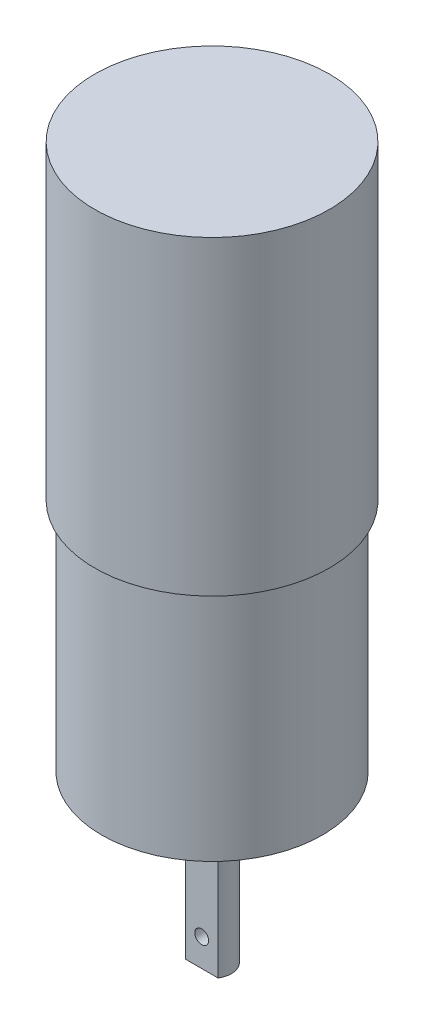
ISO-10303-21;
HEADER;
FILE_DESCRIPTION(('STEP AP214'),'2;1');
FILE_NAME('part.step','',(''),(''),'','','');
FILE_SCHEMA(('AUTOMOTIVE_DESIGN { 1 0 10303 214 1 1 1 1 }'));
ENDSEC;
DATA;
#1=APPLICATION_CONTEXT('core data for automotive mechanical design processes');
#2=APPLICATION_PROTOCOL_DEFINITION('international standard','automotive_design',2000,#1);
#3=PRODUCT_CONTEXT('',#1,'mechanical');
#4=PRODUCT('Part','Part','',(#3));
#5=PRODUCT_RELATED_PRODUCT_CATEGORY('part','',(#4));
#6=PRODUCT_DEFINITION_FORMATION('','',#4);
#7=PRODUCT_DEFINITION_CONTEXT('part definition',#1,'design');
#8=PRODUCT_DEFINITION('design','',#6,#7);
#9=PRODUCT_DEFINITION_SHAPE('','',#8);
#10=(LENGTH_UNIT() NAMED_UNIT(*) SI_UNIT(.MILLI.,.METRE.));
#11=(NAMED_UNIT(*) PLANE_ANGLE_UNIT() SI_UNIT($,.RADIAN.));
#12=(NAMED_UNIT(*) SI_UNIT($,.STERADIAN.) SOLID_ANGLE_UNIT());
#13=UNCERTAINTY_MEASURE_WITH_UNIT(LENGTH_MEASURE(1.E-05),#10,'distance_accuracy_value','');
#14=(GEOMETRIC_REPRESENTATION_CONTEXT(3) GLOBAL_UNCERTAINTY_ASSIGNED_CONTEXT((#13)) GLOBAL_UNIT_ASSIGNED_CONTEXT((#10,
#11,#12)) REPRESENTATION_CONTEXT('',''));
#15=CARTESIAN_POINT('',(0.,0.,0.));
#16=DIRECTION('',(0.,0.,1.));
#17=DIRECTION('',(1.,0.,0.));
#18=AXIS2_PLACEMENT_3D('',#15,#16,#17);
#19=CARTESIAN_POINT('',(0.,17.,0.));
#20=DIRECTION('',(0.,-1.,0.));
#21=DIRECTION('',(0.,0.,-1.));
#22=AXIS2_PLACEMENT_3D('',#19,#20,#21);
#23=CYLINDRICAL_SURFACE('',#22,8.);
#24=CARTESIAN_POINT('',(0.,17.,0.));
#25=DIRECTION('',(0.,1.,0.));
#26=DIRECTION('',(0.,0.,1.));
#27=AXIS2_PLACEMENT_3D('',#24,#25,#26);
#28=CIRCLE('',#27,8.);
#29=CARTESIAN_POINT('',(0.,17.,8.));
#30=VERTEX_POINT('',#29);
#31=EDGE_CURVE('E89',#30,#30,#28,.T.);
#32=ORIENTED_EDGE('',*,*,#31,.F.);
#33=EDGE_LOOP('',(#32));
#34=FACE_BOUND('',#33,.T.);
#35=CARTESIAN_POINT('',(0.,0.,0.));
#36=DIRECTION('',(0.,1.,0.));
#37=DIRECTION('',(0.,0.,1.));
#38=AXIS2_PLACEMENT_3D('',#35,#36,#37);
#39=CIRCLE('',#38,8.);
#40=CARTESIAN_POINT('',(0.,0.,8.));
#41=VERTEX_POINT('',#40);
#42=EDGE_CURVE('E39',#41,#41,#39,.T.);
#43=ORIENTED_EDGE('',*,*,#42,.T.);
#44=EDGE_LOOP('',(#43));
#45=FACE_BOUND('',#44,.T.);
#46=ADVANCED_FACE('F36',(#34,#45),#23,.T.);
#47=CARTESIAN_POINT('',(0.,0.,0.));
#48=DIRECTION('',(0.,1.,0.));
#49=DIRECTION('',(0.,0.,1.));
#50=AXIS2_PLACEMENT_3D('',#47,#48,#49);
#51=PLANE('',#50);
#52=CARTESIAN_POINT('',(0.,0.,0.));
#53=DIRECTION('',(0.,-1.,0.));
#54=DIRECTION('',(0.,0.,-1.));
#55=AXIS2_PLACEMENT_3D('',#52,#53,#54);
#56=CIRCLE('',#55,3.);
#57=CARTESIAN_POINT('',(0.,0.,-3.));
#58=VERTEX_POINT('',#57);
#59=EDGE_CURVE('E44',#58,#58,#56,.T.);
#60=ORIENTED_EDGE('',*,*,#59,.F.);
#61=EDGE_LOOP('',(#60));
#62=FACE_BOUND('',#61,.T.);
#63=ORIENTED_EDGE('',*,*,#42,.F.);
#64=EDGE_LOOP('',(#63));
#65=FACE_BOUND('',#64,.T.);
#66=ADVANCED_FACE('F101',(#62,#65),#51,.F.);
#67=CARTESIAN_POINT('',(0.,39.5,0.));
#68=DIRECTION('',(0.,-1.,0.));
#69=DIRECTION('',(0.,0.,-1.));
#70=AXIS2_PLACEMENT_3D('',#67,#68,#69);
#71=CYLINDRICAL_SURFACE('',#70,8.5);
#72=CARTESIAN_POINT('',(0.,39.5,0.));
#73=DIRECTION('',(0.,1.,0.));
#74=DIRECTION('',(0.,0.,1.));
#75=AXIS2_PLACEMENT_3D('',#72,#73,#74);
#76=CIRCLE('',#75,8.5);
#77=CARTESIAN_POINT('',(0.,39.5,-8.5));
#78=VERTEX_POINT('',#77);
#79=EDGE_CURVE('E90',#78,#78,#76,.T.);
#80=CARTESIAN_POINT('',(0.,17.,0.));
#81=DIRECTION('',(0.,1.,0.));
#82=DIRECTION('',(0.,0.,1.));
#83=AXIS2_PLACEMENT_3D('',#80,#81,#82);
#84=CIRCLE('',#83,8.5);
#85=CARTESIAN_POINT('',(0.,17.,-8.5));
#86=VERTEX_POINT('',#85);
#87=EDGE_CURVE('E82',#86,#86,#84,.T.);
#88=CARTESIAN_POINT('',(0.,39.5,-8.5));
#89=CARTESIAN_POINT('',(0.,39.265625,-8.5));
#90=CARTESIAN_POINT('',(0.,39.03125,-8.5));
#91=CARTESIAN_POINT('',(0.,38.5625,-8.5));
#92=CARTESIAN_POINT('',(0.,38.328125,-8.5));
#93=CARTESIAN_POINT('',(0.,37.859375,-8.5));
#94=CARTESIAN_POINT('',(0.,37.625,-8.5));
#95=CARTESIAN_POINT('',(0.,37.15625,-8.5));
#96=CARTESIAN_POINT('',(0.,36.921875,-8.5));
#97=CARTESIAN_POINT('',(0.,36.453125,-8.5));
#98=CARTESIAN_POINT('',(0.,36.21875,-8.5));
#99=CARTESIAN_POINT('',(0.,35.75,-8.5));
#100=CARTESIAN_POINT('',(0.,35.515625,-8.5));
#101=CARTESIAN_POINT('',(0.,35.046875,-8.5));
#102=CARTESIAN_POINT('',(0.,34.8125,-8.5));
#103=CARTESIAN_POINT('',(0.,34.34375,-8.5));
#104=CARTESIAN_POINT('',(0.,34.109375,-8.5));
#105=CARTESIAN_POINT('',(0.,33.640625,-8.5));
#106=CARTESIAN_POINT('',(0.,33.40625,-8.5));
#107=CARTESIAN_POINT('',(0.,32.9375,-8.5));
#108=CARTESIAN_POINT('',(0.,32.703125,-8.5));
#109=CARTESIAN_POINT('',(0.,32.234375,-8.5));
#110=CARTESIAN_POINT('',(0.,32.,-8.5));
#111=CARTESIAN_POINT('',(0.,31.53125,-8.5));
#112=CARTESIAN_POINT('',(0.,31.296875,-8.5));
#113=CARTESIAN_POINT('',(0.,30.828125,-8.5));
#114=CARTESIAN_POINT('',(0.,30.59375,-8.5));
#115=CARTESIAN_POINT('',(0.,30.125,-8.5));
#116=CARTESIAN_POINT('',(0.,29.890625,-8.5));
#117=CARTESIAN_POINT('',(0.,29.421875,-8.5));
#118=CARTESIAN_POINT('',(0.,29.1875,-8.5));
#119=CARTESIAN_POINT('',(0.,28.71875,-8.5));
#120=CARTESIAN_POINT('',(0.,28.484375,-8.5));
#121=CARTESIAN_POINT('',(0.,28.015625,-8.5));
#122=CARTESIAN_POINT('',(0.,27.78125,-8.5));
#123=CARTESIAN_POINT('',(0.,27.3125,-8.5));
#124=CARTESIAN_POINT('',(0.,27.078125,-8.5));
#125=CARTESIAN_POINT('',(0.,26.609375,-8.5));
#126=CARTESIAN_POINT('',(0.,26.375,-8.5));
#127=CARTESIAN_POINT('',(0.,25.90625,-8.5));
#128=CARTESIAN_POINT('',(0.,25.671875,-8.5));
#129=CARTESIAN_POINT('',(0.,25.203125,-8.5));
#130=CARTESIAN_POINT('',(0.,24.96875,-8.5));
#131=CARTESIAN_POINT('',(0.,24.5,-8.5));
#132=CARTESIAN_POINT('',(0.,24.265625,-8.5));
#133=CARTESIAN_POINT('',(0.,23.796875,-8.5));
#134=CARTESIAN_POINT('',(0.,23.5625,-8.5));
#135=CARTESIAN_POINT('',(0.,23.09375,-8.5));
#136=CARTESIAN_POINT('',(0.,22.859375,-8.5));
#137=CARTESIAN_POINT('',(0.,22.390625,-8.5));
#138=CARTESIAN_POINT('',(0.,22.15625,-8.5));
#139=CARTESIAN_POINT('',(0.,21.6875,-8.5));
#140=CARTESIAN_POINT('',(0.,21.453125,-8.5));
#141=CARTESIAN_POINT('',(0.,20.984375,-8.5));
#142=CARTESIAN_POINT('',(0.,20.75,-8.5));
#143=CARTESIAN_POINT('',(0.,20.28125,-8.5));
#144=CARTESIAN_POINT('',(0.,20.046875,-8.5));
#145=CARTESIAN_POINT('',(0.,19.578125,-8.5));
#146=CARTESIAN_POINT('',(0.,19.34375,-8.5));
#147=CARTESIAN_POINT('',(0.,18.875,-8.5));
#148=CARTESIAN_POINT('',(0.,18.640625,-8.5));
#149=CARTESIAN_POINT('',(0.,18.171875,-8.5));
#150=CARTESIAN_POINT('',(0.,17.9375,-8.5));
#151=CARTESIAN_POINT('',(0.,17.46875,-8.5));
#152=CARTESIAN_POINT('',(0.,17.234375,-8.5));
#153=CARTESIAN_POINT('',(0.,17.,-8.5));
#154=B_SPLINE_CURVE_WITH_KNOTS('',3,(#88,#89,#90,#91,#92,#93,#94,#95,#96,#97,#98,#99,#100,#101,
#102,#103,#104,#105,#106,#107,#108,#109,#110,#111,#112,#113,#114,#115,#116,#117,#118,#119,#120,
#121,#122,#123,#124,#125,#126,#127,#128,#129,#130,#131,#132,#133,#134,#135,#136,#137,#138,#139,
#140,#141,#142,#143,#144,#145,#146,#147,#148,#149,#150,#151,#152,#153),.UNSPECIFIED.,.F.,.F.,(4,
2,2,2,2,2,2,2,2,2,2,2,2,2,2,2,2,2,2,2,2,2,2,2,2,2,2,2,2,2,2,2,4),(0.,0.703125000000006,1.40625,
2.109375,2.8125,3.515625,4.21875,4.92187500000001,5.62500000000001,6.328125,7.03125,7.734375,
8.4375,9.140625,9.84375000000001,10.546875,11.25,11.953125,12.65625,13.359375,14.0625,14.765625,
15.46875,16.171875,16.875,17.578125,18.28125,18.984375,19.6875,20.390625,21.09375,21.796875,
22.5),.UNSPECIFIED.);
#155=EDGE_CURVE('BSEAM103',#78,#86,#154,.T.);
#156=ORIENTED_EDGE('',*,*,#79,.F.);
#157=ORIENTED_EDGE('',*,*,#87,.T.);
#158=ORIENTED_EDGE('',*,*,#155,.T.);
#159=ORIENTED_EDGE('',*,*,#155,.F.);
#160=EDGE_LOOP('',(#156,#158,#157,#159));
#161=FACE_BOUND('',#160,.T.);
#162=ADVANCED_FACE('F103',(#161),#71,.T.);
#163=CARTESIAN_POINT('',(0.,39.5,0.));
#164=DIRECTION('',(0.,1.,0.));
#165=DIRECTION('',(0.,0.,1.));
#166=AXIS2_PLACEMENT_3D('',#163,#164,#165);
#167=PLANE('',#166);
#168=ORIENTED_EDGE('',*,*,#79,.T.);
#169=EDGE_LOOP('',(#168));
#170=FACE_BOUND('',#169,.T.);
#171=ADVANCED_FACE('F109',(#170),#167,.T.);
#172=CARTESIAN_POINT('',(0.,17.,0.));
#173=DIRECTION('',(0.,1.,0.));
#174=DIRECTION('',(0.,0.,1.));
#175=AXIS2_PLACEMENT_3D('',#172,#173,#174);
#176=PLANE('',#175);
#177=ORIENTED_EDGE('',*,*,#31,.T.);
#178=EDGE_LOOP('',(#177));
#179=FACE_BOUND('',#178,.T.);
#180=ORIENTED_EDGE('',*,*,#87,.F.);
#181=EDGE_LOOP('',(#180));
#182=FACE_BOUND('',#181,.T.);
#183=ADVANCED_FACE('F115',(#179,#182),#176,.F.);
#184=CARTESIAN_POINT('',(0.,-2.,0.));
#185=DIRECTION('',(0.,1.,0.));
#186=DIRECTION('',(0.,0.,1.));
#187=AXIS2_PLACEMENT_3D('',#184,#185,#186);
#188=CYLINDRICAL_SURFACE('',#187,3.);
#189=CARTESIAN_POINT('',(0.,-2.,0.));
#190=DIRECTION('',(0.,-1.,0.));
#191=DIRECTION('',(0.,0.,-1.));
#192=AXIS2_PLACEMENT_3D('',#189,#190,#191);
#193=CIRCLE('',#192,3.);
#194=CARTESIAN_POINT('',(0.,-2.,-3.));
#195=VERTEX_POINT('',#194);
#196=EDGE_CURVE('E79',#195,#195,#193,.T.);
#197=ORIENTED_EDGE('',*,*,#196,.F.);
#198=EDGE_LOOP('',(#197));
#199=FACE_BOUND('',#198,.T.);
#200=ORIENTED_EDGE('',*,*,#59,.T.);
#201=EDGE_LOOP('',(#200));
#202=FACE_BOUND('',#201,.T.);
#203=ADVANCED_FACE('F118',(#199,#202),#188,.T.);
#204=CARTESIAN_POINT('',(0.,-2.,0.));
#205=DIRECTION('',(0.,-1.,0.));
#206=DIRECTION('',(0.,0.,-1.));
#207=AXIS2_PLACEMENT_3D('',#204,#205,#206);
#208=PLANE('',#207);
#209=CARTESIAN_POINT('',(0.,-2.,0.));
#210=DIRECTION('',(0.,-1.,0.));
#211=DIRECTION('',(0.,0.,-1.));
#212=AXIS2_PLACEMENT_3D('',#209,#210,#211);
#213=CIRCLE('',#212,1.4);
#214=CARTESIAN_POINT('',(0.,-2.,-1.4));
#215=VERTEX_POINT('',#214);
#216=EDGE_CURVE('E13',#215,#215,#213,.T.);
#217=ORIENTED_EDGE('',*,*,#216,.F.);
#218=EDGE_LOOP('',(#217));
#219=FACE_BOUND('',#218,.T.);
#220=ORIENTED_EDGE('',*,*,#196,.T.);
#221=EDGE_LOOP('',(#220));
#222=FACE_BOUND('',#221,.T.);
#223=ADVANCED_FACE('F124',(#219,#222),#208,.T.);
#224=CARTESIAN_POINT('',(0.,-12.,0.));
#225=DIRECTION('',(0.,1.,0.));
#226=DIRECTION('',(0.,0.,1.));
#227=AXIS2_PLACEMENT_3D('',#224,#225,#226);
#228=CYLINDRICAL_SURFACE('',#227,1.4);
#229=CARTESIAN_POINT('',(0.5,-10.,-1.3076696830622));
#230=CARTESIAN_POINT('',(0.500000586286718,-10.0271054124732,-1.30766916975278));
#231=CARTESIAN_POINT('',(0.497788498892349,-10.0542067727115,-1.30852162820293));
#232=CARTESIAN_POINT('',(0.48903419370483,-10.1075985837858,-1.31181823091352));
#233=CARTESIAN_POINT('',(0.482491762044729,-10.1338889945035,-1.31426245378791));
#234=CARTESIAN_POINT('',(0.465342373272102,-10.1848749518152,-1.32043116334706));
#235=CARTESIAN_POINT('',(0.454744355211831,-10.2095738673704,-1.32415283252436));
#236=CARTESIAN_POINT('',(0.42981584533665,-10.2568521737579,-1.33245275571667));
#237=CARTESIAN_POINT('',(0.415484353082896,-10.2794309942702,-1.33703123923481));
#238=CARTESIAN_POINT('',(0.382804895178282,-10.3228442397825,-1.346759864502));
#239=CARTESIAN_POINT('',(0.364316648228027,-10.3435695724128,-1.35192572685036));
#240=CARTESIAN_POINT('',(0.32414690239621,-10.3817013697362,-1.36211516069867));
#241=CARTESIAN_POINT('',(0.302464802032106,-10.3991072078656,-1.36713870518367));
#242=CARTESIAN_POINT('',(0.255708175523562,-10.4306178173705,-1.37666219559448));
#243=CARTESIAN_POINT('',(0.230550437540506,-10.444605898486,-1.38114153362605));
#244=CARTESIAN_POINT('',(0.17805101268317,-10.4681070110908,-1.38888461352772));
#245=CARTESIAN_POINT('',(0.150710010959814,-10.4776214400936,-1.39214873495002));
#246=CARTESIAN_POINT('',(0.0957657453298594,-10.49152818976,-1.39698212319727));
#247=CARTESIAN_POINT('',(0.0682154570410609,-10.4961079120471,-1.39861321869233));
#248=CARTESIAN_POINT('',(0.0126923442496112,-10.5006136779655,-1.40021759580969));
#249=CARTESIAN_POINT('',(-0.0152803531037873,-10.5005410951306,-1.40019136673595));
#250=CARTESIAN_POINT('',(-0.0695184746989103,-10.4958577604871,-1.39852452153371));
#251=CARTESIAN_POINT('',(-0.095804130363718,-10.4914510987236,-1.39695650827113));
#252=CARTESIAN_POINT('',(-0.147234826340375,-10.4785654297714,-1.39247570378362));
#253=CARTESIAN_POINT('',(-0.17237978687425,-10.4700861382301,-1.38956281865974));
#254=CARTESIAN_POINT('',(-0.221232193361942,-10.4491906168348,-1.38263301557224));
#255=CARTESIAN_POINT('',(-0.244914536371773,-10.436720846601,-1.3786011885313));
#256=CARTESIAN_POINT('',(-0.289907039173932,-10.4082441719804,-1.36984671580644));
#257=CARTESIAN_POINT('',(-0.31121647312091,-10.3922361897409,-1.36512385976142));
#258=CARTESIAN_POINT('',(-0.352066496064169,-10.356133844813,-1.35518070728684));
#259=CARTESIAN_POINT('',(-0.371451356532619,-10.335866619611,-1.34994731599432));
#260=CARTESIAN_POINT('',(-0.406602221763147,-10.2923313025163,-1.33977992476104));
#261=CARTESIAN_POINT('',(-0.422367483627403,-10.2690625961181,-1.33484598643355));
#262=CARTESIAN_POINT('',(-0.450091802278126,-10.2196244696085,-1.32575824877674));
#263=CARTESIAN_POINT('',(-0.461975127517565,-10.1934093866859,-1.32162055335396));
#264=CARTESIAN_POINT('',(-0.481102213164341,-10.1391641095823,-1.31477947915827));
#265=CARTESIAN_POINT('',(-0.488348268951177,-10.1111348209836,-1.31207539088503));
#266=CARTESIAN_POINT('',(-0.497657432128162,-10.0555832228574,-1.30857201132177));
#267=CARTESIAN_POINT('',(-0.499965409382025,-10.0281076374681,-1.30768283361542));
#268=CARTESIAN_POINT('',(-0.500033795685699,-9.97315332495208,-1.30765683822443));
#269=CARTESIAN_POINT('',(-0.497795195938854,-9.94567459981578,-1.30851963858947));
#270=CARTESIAN_POINT('',(-0.489055199090293,-9.89268524505102,-1.31180980958598));
#271=CARTESIAN_POINT('',(-0.482734371977471,-9.86714025128367,-1.31417083503748));
#272=CARTESIAN_POINT('',(-0.46623184790025,-9.81748201700222,-1.32011523791859));
#273=CARTESIAN_POINT('',(-0.456049405401431,-9.79336905400041,-1.32369885137107));
#274=CARTESIAN_POINT('',(-0.431708806965407,-9.74631996450212,-1.33183979573767));
#275=CARTESIAN_POINT('',(-0.417423691017916,-9.72345481484341,-1.33642687963943));
#276=CARTESIAN_POINT('',(-0.385422112414717,-9.68035845583947,-1.34600459490538));
#277=CARTESIAN_POINT('',(-0.367704498330818,-9.66012813416351,-1.35099536135633));
#278=CARTESIAN_POINT('',(-0.328154087000809,-9.62169146200073,-1.36115913287807));
#279=CARTESIAN_POINT('',(-0.306145303326371,-9.60366412290745,-1.36632649585586));
#280=CARTESIAN_POINT('',(-0.259287428726957,-9.57154146298986,-1.37598745874002));
#281=CARTESIAN_POINT('',(-0.234438385286682,-9.55744607644302,-1.38048106990756));
#282=CARTESIAN_POINT('',(-0.182676094785286,-9.53369995531836,-1.38827596831939));
#283=CARTESIAN_POINT('',(-0.155774087864596,-9.52402679650787,-1.39158325235878));
#284=CARTESIAN_POINT('',(-0.100581379784348,-9.50939062818857,-1.39665667196625));
#285=CARTESIAN_POINT('',(-0.0722912687052932,-9.5044256351823,-1.39842345650422));
#286=CARTESIAN_POINT('',(-0.0167515018572274,-9.49954540667113,-1.40016076376521));
#287=CARTESIAN_POINT('',(0.0104730899911747,-9.49937477871021,-1.40022213085299));
#288=CARTESIAN_POINT('',(0.0645453607382948,-9.50344307539735,-1.39877273018288));
#289=CARTESIAN_POINT('',(0.0913930779161098,-9.50768154888089,-1.39726212327837));
#290=CARTESIAN_POINT('',(0.143396264466119,-9.52027202585912,-1.39287662214799));
#291=CARTESIAN_POINT('',(0.168575111199859,-9.52853814467369,-1.39003025616092));
#292=CARTESIAN_POINT('',(0.217194286852335,-9.54886661814618,-1.38326777539725));
#293=CARTESIAN_POINT('',(0.240634288989817,-9.56092968414272,-1.3793514601893));
#294=CARTESIAN_POINT('',(0.286136467614816,-9.58906227046476,-1.37065098097097));
#295=CARTESIAN_POINT('',(0.308105869800789,-9.60527289501969,-1.36583834232111));
#296=CARTESIAN_POINT('',(0.349093694553511,-9.64101049183834,-1.35594209209472));
#297=CARTESIAN_POINT('',(0.368111104310788,-9.66053859751667,-1.35085838831766));
#298=CARTESIAN_POINT('',(0.403564441729085,-9.70344376543482,-1.34070576768502));
#299=CARTESIAN_POINT('',(0.419838360410448,-9.72695797548378,-1.33564862600534));
#300=CARTESIAN_POINT('',(0.448201597622297,-9.77654768286215,-1.32640070320329));
#301=CARTESIAN_POINT('',(0.460291198453756,-9.80262300724988,-1.3222098636423));
#302=CARTESIAN_POINT('',(0.479906666414789,-9.85674818476745,-1.31521842646606));
#303=CARTESIAN_POINT('',(0.487413443749438,-9.88480576127448,-1.31242365283739));
#304=CARTESIAN_POINT('',(0.497458549650272,-9.94191077870752,-1.30865001181385));
#305=CARTESIAN_POINT('',(0.499999371818977,-9.97095771537744,-1.30767023305118));
#306=CARTESIAN_POINT('',(0.5,-10.,-1.3076696830622));
#307=B_SPLINE_CURVE_WITH_KNOTS('',3,(#229,#230,#231,#232,#233,#234,#235,#236,#237,#238,#239,
#240,#241,#242,#243,#244,#245,#246,#247,#248,#249,#250,#251,#252,#253,#254,#255,#256,#257,#258,
#259,#260,#261,#262,#263,#264,#265,#266,#267,#268,#269,#270,#271,#272,#273,#274,#275,#276,#277,
#278,#279,#280,#281,#282,#283,#284,#285,#286,#287,#288,#289,#290,#291,#292,#293,#294,#295,#296,
#297,#298,#299,#300,#301,#302,#303,#304,#305,#306),.UNSPECIFIED.,.T.,.F.,(4,2,2,2,2,2,2,2,2,2,2,
2,2,2,2,2,2,2,2,2,2,2,2,2,2,2,2,2,2,2,2,2,2,2,2,2,2,2,4),(0.,0.0812083532552648,
0.162420717526269,0.243455100465127,0.324511220124237,0.40888200503911,0.493268699446805,
0.58022562736742,0.667155372943022,0.75065292044796,0.834125816480507,0.913847474674569,
0.993574699875844,1.07441994211824,1.15528984644186,1.24048833552657,1.32570429541689,
1.41249521858965,1.49924314824905,1.58157890713011,1.66389671784508,1.74280188359715,
1.82172229076582,1.90341177180135,1.9851287030911,2.07146409655747,2.15779804684214,
2.24368922211804,2.32954419630778,2.41081654022161,2.49208056870185,2.57168292881197,
2.65130021090219,2.73410603214592,2.81694020103309,2.90364232426899,2.99033859688172,
3.07739358249771,3.1644048431196),.UNSPECIFIED.);
#308=CARTESIAN_POINT('',(0.5,-10.,-1.3076696830622));
#309=VERTEX_POINT('',#308);
#310=EDGE_CURVE('E69',#309,#309,#307,.T.);
#311=ORIENTED_EDGE('',*,*,#310,.F.);
#312=EDGE_LOOP('',(#311));
#313=FACE_BOUND('',#312,.T.);
#314=CARTESIAN_POINT('',(0.,-12.,0.));
#315=DIRECTION('',(0.,-1.,0.));
#316=DIRECTION('',(0.,0.,-1.));
#317=AXIS2_PLACEMENT_3D('',#314,#315,#316);
#318=CIRCLE('',#317,1.4);
#319=CARTESIAN_POINT('',(-1.18215904175369,-12.,0.75));
#320=VERTEX_POINT('',#319);
#321=CARTESIAN_POINT('',(1.18215904175369,-12.,0.75));
#322=VERTEX_POINT('',#321);
#323=EDGE_CURVE('E75',#320,#322,#318,.T.);
#324=ORIENTED_EDGE('',*,*,#323,.F.);
#325=DIRECTION('',(0.,-1.,0.));
#326=VECTOR('',#325,1.);
#327=CARTESIAN_POINT('',(-1.18215904175369,0.452039967047848,0.75));
#328=LINE('',#327,#326);
#329=CARTESIAN_POINT('',(-1.18215904175369,-3.5,0.75));
#330=VERTEX_POINT('',#329);
#331=EDGE_CURVE('E52',#330,#320,#328,.T.);
#332=ORIENTED_EDGE('',*,*,#331,.F.);
#333=CARTESIAN_POINT('',(0.,-3.5,0.));
#334=DIRECTION('',(0.,-1.,0.));
#335=DIRECTION('',(0.,0.,-1.));
#336=AXIS2_PLACEMENT_3D('',#333,#334,#335);
#337=CIRCLE('',#336,1.4);
#338=CARTESIAN_POINT('',(1.18215904175369,-3.5,0.75));
#339=VERTEX_POINT('',#338);
#340=EDGE_CURVE('E76',#330,#339,#337,.F.);
#341=ORIENTED_EDGE('',*,*,#340,.T.);
#342=DIRECTION('',(0.,-1.,0.));
#343=VECTOR('',#342,1.);
#344=CARTESIAN_POINT('',(1.18215904175369,0.452039967047848,0.75));
#345=LINE('',#344,#343);
#346=EDGE_CURVE('E65',#339,#322,#345,.T.);
#347=ORIENTED_EDGE('',*,*,#346,.T.);
#348=EDGE_LOOP('',(#324,#332,#341,#347));
#349=FACE_BOUND('',#348,.T.);
#350=ORIENTED_EDGE('',*,*,#216,.T.);
#351=EDGE_LOOP('',(#350));
#352=FACE_BOUND('',#351,.T.);
#353=ADVANCED_FACE('F73',(#313,#349,#352),#228,.T.);
#354=CARTESIAN_POINT('',(0.,-12.,0.));
#355=DIRECTION('',(0.,-1.,0.));
#356=DIRECTION('',(0.,0.,-1.));
#357=AXIS2_PLACEMENT_3D('',#354,#355,#356);
#358=PLANE('',#357);
#359=DIRECTION('',(1.,0.,0.));
#360=VECTOR('',#359,1.);
#361=CARTESIAN_POINT('',(-1.18215904175369,-12.,0.75));
#362=LINE('',#361,#360);
#363=EDGE_CURVE('E62',#320,#322,#362,.T.);
#364=ORIENTED_EDGE('',*,*,#363,.F.);
#365=ORIENTED_EDGE('',*,*,#323,.T.);
#366=EDGE_LOOP('',(#364,#365));
#367=FACE_BOUND('',#366,.T.);
#368=ADVANCED_FACE('F78',(#367),#358,.T.);
#369=CARTESIAN_POINT('',(-1.18215904175369,0.452039967047848,0.75));
#370=DIRECTION('',(0.,0.,-1.));
#371=DIRECTION('',(-1.,0.,0.));
#372=AXIS2_PLACEMENT_3D('',#369,#370,#371);
#373=PLANE('',#372);
#374=CARTESIAN_POINT('',(0.,-10.,0.75));
#375=DIRECTION('',(0.,0.,1.));
#376=DIRECTION('',(1.,0.,0.));
#377=AXIS2_PLACEMENT_3D('',#374,#375,#376);
#378=CIRCLE('',#377,0.5);
#379=CARTESIAN_POINT('',(0.5,-10.,0.75));
#380=VERTEX_POINT('',#379);
#381=EDGE_CURVE('E154',#380,#380,#378,.T.);
#382=ORIENTED_EDGE('',*,*,#381,.F.);
#383=EDGE_LOOP('',(#382));
#384=FACE_BOUND('',#383,.T.);
#385=DIRECTION('',(-1.,0.,0.));
#386=VECTOR('',#385,1.);
#387=CARTESIAN_POINT('',(-1.18215904175369,-3.5,0.75));
#388=LINE('',#387,#386);
#389=EDGE_CURVE('E57',#339,#330,#388,.T.);
#390=ORIENTED_EDGE('',*,*,#389,.T.);
#391=ORIENTED_EDGE('',*,*,#331,.T.);
#392=ORIENTED_EDGE('',*,*,#363,.T.);
#393=ORIENTED_EDGE('',*,*,#346,.F.);
#394=EDGE_LOOP('',(#390,#391,#392,#393));
#395=FACE_BOUND('',#394,.T.);
#396=ADVANCED_FACE('F64',(#384,#395),#373,.F.);
#397=CARTESIAN_POINT('',(0.,-3.5,0.));
#398=DIRECTION('',(0.,-1.,0.));
#399=DIRECTION('',(0.,0.,-1.));
#400=AXIS2_PLACEMENT_3D('',#397,#398,#399);
#401=PLANE('',#400);
#402=ORIENTED_EDGE('',*,*,#340,.F.);
#403=ORIENTED_EDGE('',*,*,#389,.F.);
#404=EDGE_LOOP('',(#402,#403));
#405=FACE_BOUND('',#404,.T.);
#406=ADVANCED_FACE('F136',(#405),#401,.T.);
#407=CARTESIAN_POINT('',(0.,-10.,-8.501));
#408=DIRECTION('',(0.,0.,1.));
#409=DIRECTION('',(1.,0.,0.));
#410=AXIS2_PLACEMENT_3D('',#407,#408,#409);
#411=CYLINDRICAL_SURFACE('',#410,0.5);
#412=ORIENTED_EDGE('',*,*,#381,.T.);
#413=EDGE_LOOP('',(#412));
#414=FACE_BOUND('',#413,.T.);
#415=ORIENTED_EDGE('',*,*,#310,.T.);
#416=EDGE_LOOP('',(#415));
#417=FACE_BOUND('',#416,.T.);
#418=ADVANCED_FACE('F140',(#414,#417),#411,.F.);
#419=CLOSED_SHELL('',(#46,#66,#162,#171,#183,#203,#223,#353,#368,#396,#406,#418));
#420=MANIFOLD_SOLID_BREP('B2',#419);
#421=ADVANCED_BREP_SHAPE_REPRESENTATION('',(#18,#420),#14);
#422=SHAPE_DEFINITION_REPRESENTATION(#9,#421);
ENDSEC;
END-ISO-10303-21;
